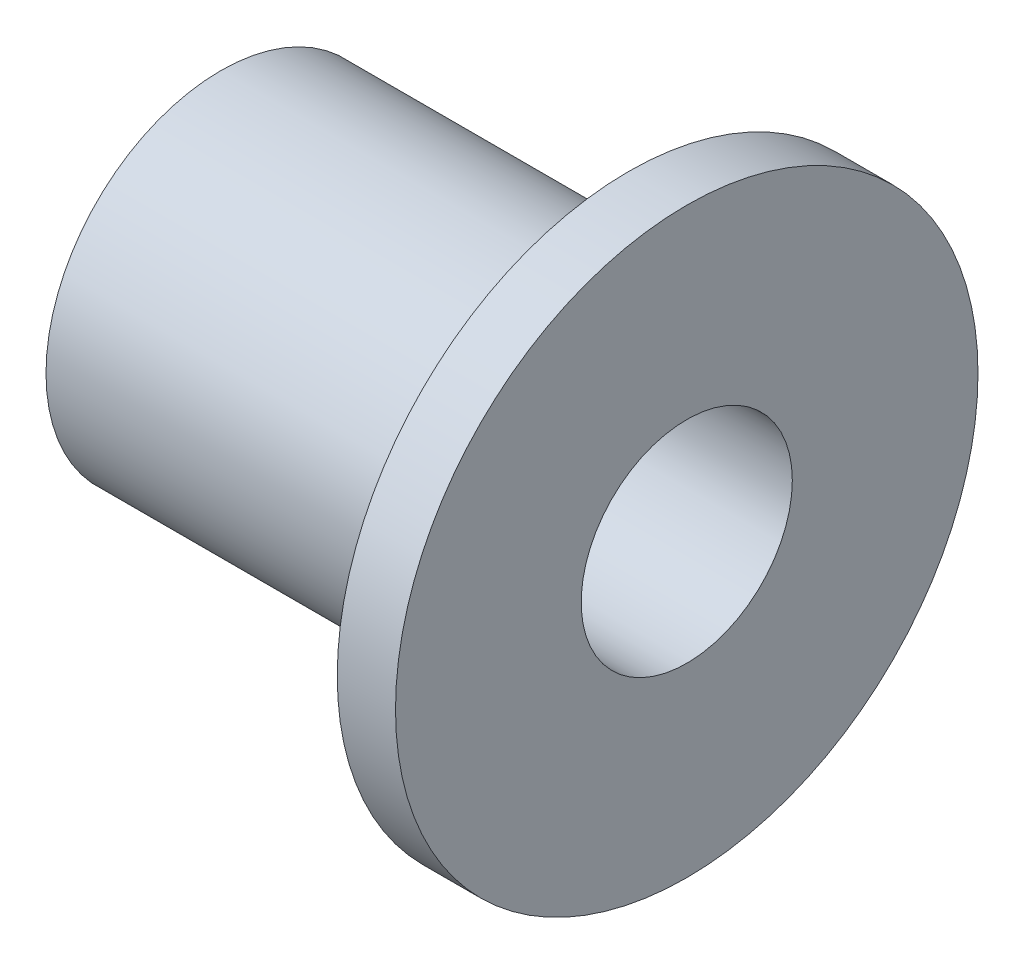
ISO-10303-21;
HEADER;
FILE_DESCRIPTION(('STEP AP214'),'2;1');
FILE_NAME('part.step','',(''),(''),'','','');
FILE_SCHEMA(('AUTOMOTIVE_DESIGN { 1 0 10303 214 1 1 1 1 }'));
ENDSEC;
DATA;
#1=APPLICATION_CONTEXT('core data for automotive mechanical design processes');
#2=APPLICATION_PROTOCOL_DEFINITION('international standard','automotive_design',2000,#1);
#3=PRODUCT_CONTEXT('',#1,'mechanical');
#4=PRODUCT('Part','Part','',(#3));
#5=PRODUCT_RELATED_PRODUCT_CATEGORY('part','',(#4));
#6=PRODUCT_DEFINITION_FORMATION('','',#4);
#7=PRODUCT_DEFINITION_CONTEXT('part definition',#1,'design');
#8=PRODUCT_DEFINITION('design','',#6,#7);
#9=PRODUCT_DEFINITION_SHAPE('','',#8);
#10=(LENGTH_UNIT() NAMED_UNIT(*) SI_UNIT(.MILLI.,.METRE.));
#11=(NAMED_UNIT(*) PLANE_ANGLE_UNIT() SI_UNIT($,.RADIAN.));
#12=(NAMED_UNIT(*) SI_UNIT($,.STERADIAN.) SOLID_ANGLE_UNIT());
#13=UNCERTAINTY_MEASURE_WITH_UNIT(LENGTH_MEASURE(1.E-05),#10,'distance_accuracy_value','');
#14=(GEOMETRIC_REPRESENTATION_CONTEXT(3) GLOBAL_UNCERTAINTY_ASSIGNED_CONTEXT((#13)) GLOBAL_UNIT_ASSIGNED_CONTEXT((#10,
#11,#12)) REPRESENTATION_CONTEXT('',''));
#15=CARTESIAN_POINT('',(0.,0.,0.));
#16=DIRECTION('',(0.,0.,1.));
#17=DIRECTION('',(1.,0.,0.));
#18=AXIS2_PLACEMENT_3D('',#15,#16,#17);
#19=CARTESIAN_POINT('',(0.,0.,0.));
#20=DIRECTION('',(1.,0.,0.));
#21=DIRECTION('',(0.,0.,-1.));
#22=AXIS2_PLACEMENT_3D('',#19,#20,#21);
#23=PLANE('',#22);
#24=CARTESIAN_POINT('',(0.,0.,0.));
#25=DIRECTION('',(1.,0.,0.));
#26=DIRECTION('',(0.,0.,-1.));
#27=AXIS2_PLACEMENT_3D('',#24,#25,#26);
#28=CIRCLE('',#27,5.75436999999999);
#29=CARTESIAN_POINT('',(0.,0.,-5.75436999999999));
#30=VERTEX_POINT('',#29);
#31=EDGE_CURVE('E51',#30,#30,#28,.T.);
#32=ORIENTED_EDGE('',*,*,#31,.T.);
#33=EDGE_LOOP('',(#32));
#34=FACE_BOUND('',#33,.T.);
#35=CARTESIAN_POINT('',(0.,0.,0.));
#36=DIRECTION('',(-1.,0.,0.));
#37=DIRECTION('',(0.,0.,1.));
#38=AXIS2_PLACEMENT_3D('',#35,#36,#37);
#39=CIRCLE('',#38,9.525);
#40=CARTESIAN_POINT('',(0.,0.,9.525));
#41=VERTEX_POINT('',#40);
#42=EDGE_CURVE('E10',#41,#41,#39,.T.);
#43=ORIENTED_EDGE('',*,*,#42,.T.);
#44=EDGE_LOOP('',(#43));
#45=FACE_BOUND('',#44,.T.);
#46=ADVANCED_FACE('F32',(#34,#45),#23,.F.);
#47=CARTESIAN_POINT('',(0.,0.,0.));
#48=DIRECTION('',(-1.,0.,0.));
#49=DIRECTION('',(0.,0.,1.));
#50=AXIS2_PLACEMENT_3D('',#47,#48,#49);
#51=CYLINDRICAL_SURFACE('',#50,9.525);
#52=ORIENTED_EDGE('',*,*,#42,.F.);
#53=EDGE_LOOP('',(#52));
#54=FACE_BOUND('',#53,.T.);
#55=CARTESIAN_POINT('',(22.225,0.,0.));
#56=DIRECTION('',(-1.,0.,0.));
#57=DIRECTION('',(0.,0.,1.));
#58=AXIS2_PLACEMENT_3D('',#55,#56,#57);
#59=CIRCLE('',#58,9.525);
#60=CARTESIAN_POINT('',(22.225,0.,9.525));
#61=VERTEX_POINT('',#60);
#62=EDGE_CURVE('E38',#61,#61,#59,.T.);
#63=ORIENTED_EDGE('',*,*,#62,.T.);
#64=EDGE_LOOP('',(#63));
#65=FACE_BOUND('',#64,.T.);
#66=ADVANCED_FACE('F74',(#54,#65),#51,.T.);
#67=CARTESIAN_POINT('',(22.225,9.525,0.));
#68=DIRECTION('',(1.,0.,0.));
#69=DIRECTION('',(0.,0.,-1.));
#70=AXIS2_PLACEMENT_3D('',#67,#68,#69);
#71=PLANE('',#70);
#72=ORIENTED_EDGE('',*,*,#62,.F.);
#73=EDGE_LOOP('',(#72));
#74=FACE_BOUND('',#73,.T.);
#75=CARTESIAN_POINT('',(22.225,0.,0.));
#76=DIRECTION('',(-1.,0.,0.));
#77=DIRECTION('',(0.,0.,1.));
#78=AXIS2_PLACEMENT_3D('',#75,#76,#77);
#79=CIRCLE('',#78,15.875);
#80=CARTESIAN_POINT('',(22.225,0.,15.875));
#81=VERTEX_POINT('',#80);
#82=EDGE_CURVE('E42',#81,#81,#79,.T.);
#83=ORIENTED_EDGE('',*,*,#82,.T.);
#84=EDGE_LOOP('',(#83));
#85=FACE_BOUND('',#84,.T.);
#86=ADVANCED_FACE('F68',(#74,#85),#71,.F.);
#87=CARTESIAN_POINT('',(0.,0.,0.));
#88=DIRECTION('',(-1.,0.,0.));
#89=DIRECTION('',(0.,0.,1.));
#90=AXIS2_PLACEMENT_3D('',#87,#88,#89);
#91=CYLINDRICAL_SURFACE('',#90,15.875);
#92=ORIENTED_EDGE('',*,*,#82,.F.);
#93=EDGE_LOOP('',(#92));
#94=FACE_BOUND('',#93,.T.);
#95=CARTESIAN_POINT('',(25.4,0.,0.));
#96=DIRECTION('',(-1.,0.,0.));
#97=DIRECTION('',(0.,0.,1.));
#98=AXIS2_PLACEMENT_3D('',#95,#96,#97);
#99=CIRCLE('',#98,15.875);
#100=CARTESIAN_POINT('',(25.4,0.,15.875));
#101=VERTEX_POINT('',#100);
#102=EDGE_CURVE('E46',#101,#101,#99,.T.);
#103=ORIENTED_EDGE('',*,*,#102,.T.);
#104=EDGE_LOOP('',(#103));
#105=FACE_BOUND('',#104,.T.);
#106=ADVANCED_FACE('F63',(#94,#105),#91,.T.);
#107=CARTESIAN_POINT('',(25.4,15.875,0.));
#108=DIRECTION('',(-1.,0.,0.));
#109=DIRECTION('',(0.,0.,1.));
#110=AXIS2_PLACEMENT_3D('',#107,#108,#109);
#111=PLANE('',#110);
#112=CARTESIAN_POINT('',(25.4,0.,0.));
#113=DIRECTION('',(1.,0.,0.));
#114=DIRECTION('',(0.,0.,-1.));
#115=AXIS2_PLACEMENT_3D('',#112,#113,#114);
#116=CIRCLE('',#115,5.75436999999999);
#117=CARTESIAN_POINT('',(25.4,0.,-5.75436999999999));
#118=VERTEX_POINT('',#117);
#119=EDGE_CURVE('E54',#118,#118,#116,.T.);
#120=ORIENTED_EDGE('',*,*,#119,.F.);
#121=EDGE_LOOP('',(#120));
#122=FACE_BOUND('',#121,.T.);
#123=ORIENTED_EDGE('',*,*,#102,.F.);
#124=EDGE_LOOP('',(#123));
#125=FACE_BOUND('',#124,.T.);
#126=ADVANCED_FACE('F60',(#122,#125),#111,.F.);
#127=CARTESIAN_POINT('',(25.4,0.,0.));
#128=DIRECTION('',(1.,0.,0.));
#129=DIRECTION('',(0.,0.,-1.));
#130=AXIS2_PLACEMENT_3D('',#127,#128,#129);
#131=CYLINDRICAL_SURFACE('',#130,5.75436999999999);
#132=ORIENTED_EDGE('',*,*,#31,.F.);
#133=EDGE_LOOP('',(#132));
#134=FACE_BOUND('',#133,.T.);
#135=ORIENTED_EDGE('',*,*,#119,.T.);
#136=EDGE_LOOP('',(#135));
#137=FACE_BOUND('',#136,.T.);
#138=ADVANCED_FACE('F58',(#134,#137),#131,.F.);
#139=CLOSED_SHELL('',(#46,#66,#86,#106,#126,#138));
#140=MANIFOLD_SOLID_BREP('B2',#139);
#141=ADVANCED_BREP_SHAPE_REPRESENTATION('',(#18,#140),#14);
#142=SHAPE_DEFINITION_REPRESENTATION(#9,#141);
ENDSEC;
END-ISO-10303-21;
